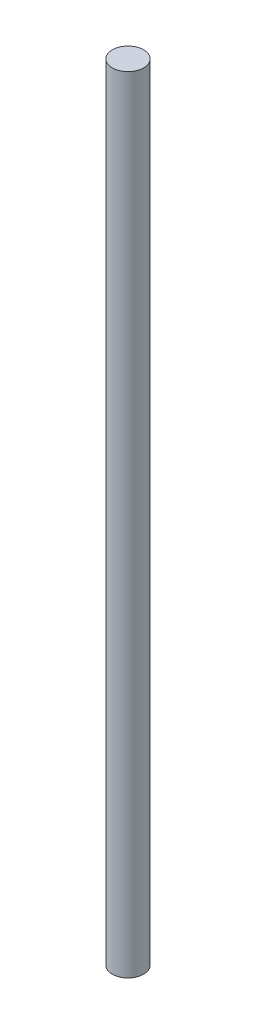
ISO-10303-21;
HEADER;
FILE_DESCRIPTION(('STEP AP214'),'2;1');
FILE_NAME('part.step','',(''),(''),'','','');
FILE_SCHEMA(('AUTOMOTIVE_DESIGN { 1 0 10303 214 1 1 1 1 }'));
ENDSEC;
DATA;
#1=APPLICATION_CONTEXT('core data for automotive mechanical design processes');
#2=APPLICATION_PROTOCOL_DEFINITION('international standard','automotive_design',2000,#1);
#3=PRODUCT_CONTEXT('',#1,'mechanical');
#4=PRODUCT('Part','Part','',(#3));
#5=PRODUCT_RELATED_PRODUCT_CATEGORY('part','',(#4));
#6=PRODUCT_DEFINITION_FORMATION('','',#4);
#7=PRODUCT_DEFINITION_CONTEXT('part definition',#1,'design');
#8=PRODUCT_DEFINITION('design','',#6,#7);
#9=PRODUCT_DEFINITION_SHAPE('','',#8);
#10=(LENGTH_UNIT() NAMED_UNIT(*) SI_UNIT(.MILLI.,.METRE.));
#11=(NAMED_UNIT(*) PLANE_ANGLE_UNIT() SI_UNIT($,.RADIAN.));
#12=(NAMED_UNIT(*) SI_UNIT($,.STERADIAN.) SOLID_ANGLE_UNIT());
#13=UNCERTAINTY_MEASURE_WITH_UNIT(LENGTH_MEASURE(1.E-05),#10,'distance_accuracy_value','');
#14=(GEOMETRIC_REPRESENTATION_CONTEXT(3) GLOBAL_UNCERTAINTY_ASSIGNED_CONTEXT((#13)) GLOBAL_UNIT_ASSIGNED_CONTEXT((#10,
#11,#12)) REPRESENTATION_CONTEXT('',''));
#15=CARTESIAN_POINT('',(0.,0.,0.));
#16=DIRECTION('',(0.,0.,1.));
#17=DIRECTION('',(1.,0.,0.));
#18=AXIS2_PLACEMENT_3D('',#15,#16,#17);
#19=CARTESIAN_POINT('',(0.,125.,0.));
#20=DIRECTION('',(0.,-1.,0.));
#21=DIRECTION('',(0.,0.,-1.));
#22=AXIS2_PLACEMENT_3D('',#19,#20,#21);
#23=CYLINDRICAL_SURFACE('',#22,5.);
#24=CARTESIAN_POINT('',(0.,125.,0.));
#25=DIRECTION('',(0.,1.,0.));
#26=DIRECTION('',(0.,0.,1.));
#27=AXIS2_PLACEMENT_3D('',#24,#25,#26);
#28=CIRCLE('',#27,5.);
#29=CARTESIAN_POINT('',(0.,125.,5.));
#30=VERTEX_POINT('',#29);
#31=EDGE_CURVE('E10',#30,#30,#28,.T.);
#32=ORIENTED_EDGE('',*,*,#31,.F.);
#33=EDGE_LOOP('',(#32));
#34=FACE_BOUND('',#33,.T.);
#35=CARTESIAN_POINT('',(0.,-125.,0.));
#36=DIRECTION('',(0.,1.,0.));
#37=DIRECTION('',(0.,0.,1.));
#38=AXIS2_PLACEMENT_3D('',#35,#36,#37);
#39=CIRCLE('',#38,5.);
#40=CARTESIAN_POINT('',(0.,-125.,5.));
#41=VERTEX_POINT('',#40);
#42=EDGE_CURVE('E43',#41,#41,#39,.T.);
#43=ORIENTED_EDGE('',*,*,#42,.T.);
#44=EDGE_LOOP('',(#43));
#45=FACE_BOUND('',#44,.T.);
#46=ADVANCED_FACE('F40',(#34,#45),#23,.T.);
#47=CARTESIAN_POINT('',(0.,125.,0.));
#48=DIRECTION('',(0.,1.,0.));
#49=DIRECTION('',(0.,0.,1.));
#50=AXIS2_PLACEMENT_3D('',#47,#48,#49);
#51=PLANE('',#50);
#52=ORIENTED_EDGE('',*,*,#31,.T.);
#53=EDGE_LOOP('',(#52));
#54=FACE_BOUND('',#53,.T.);
#55=ADVANCED_FACE('F57',(#54),#51,.T.);
#56=CARTESIAN_POINT('',(0.,-125.,0.));
#57=DIRECTION('',(0.,1.,0.));
#58=DIRECTION('',(0.,0.,1.));
#59=AXIS2_PLACEMENT_3D('',#56,#57,#58);
#60=PLANE('',#59);
#61=ORIENTED_EDGE('',*,*,#42,.F.);
#62=EDGE_LOOP('',(#61));
#63=FACE_BOUND('',#62,.T.);
#64=ADVANCED_FACE('F55',(#63),#60,.F.);
#65=CLOSED_SHELL('',(#46,#55,#64));
#66=MANIFOLD_SOLID_BREP('B2',#65);
#67=ADVANCED_BREP_SHAPE_REPRESENTATION('',(#18,#66),#14);
#68=SHAPE_DEFINITION_REPRESENTATION(#9,#67);
ENDSEC;
END-ISO-10303-21;
